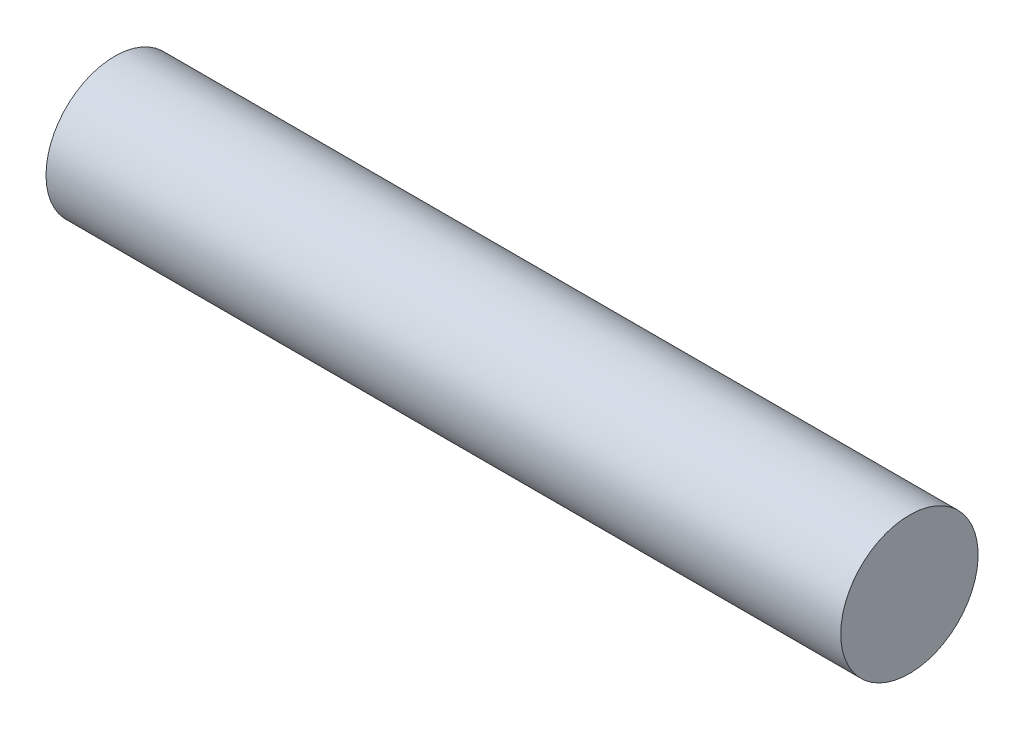
ISO-10303-21;
HEADER;
FILE_DESCRIPTION(('STEP AP214'),'2;1');
FILE_NAME('part.step','',(''),(''),'','','');
FILE_SCHEMA(('AUTOMOTIVE_DESIGN { 1 0 10303 214 1 1 1 1 }'));
ENDSEC;
DATA;
#1=APPLICATION_CONTEXT('core data for automotive mechanical design processes');
#2=APPLICATION_PROTOCOL_DEFINITION('international standard','automotive_design',2000,#1);
#3=PRODUCT_CONTEXT('',#1,'mechanical');
#4=PRODUCT('Part','Part','',(#3));
#5=PRODUCT_RELATED_PRODUCT_CATEGORY('part','',(#4));
#6=PRODUCT_DEFINITION_FORMATION('','',#4);
#7=PRODUCT_DEFINITION_CONTEXT('part definition',#1,'design');
#8=PRODUCT_DEFINITION('design','',#6,#7);
#9=PRODUCT_DEFINITION_SHAPE('','',#8);
#10=(LENGTH_UNIT() NAMED_UNIT(*) SI_UNIT(.MILLI.,.METRE.));
#11=(NAMED_UNIT(*) PLANE_ANGLE_UNIT() SI_UNIT($,.RADIAN.));
#12=(NAMED_UNIT(*) SI_UNIT($,.STERADIAN.) SOLID_ANGLE_UNIT());
#13=UNCERTAINTY_MEASURE_WITH_UNIT(LENGTH_MEASURE(1.E-05),#10,'distance_accuracy_value','');
#14=(GEOMETRIC_REPRESENTATION_CONTEXT(3) GLOBAL_UNCERTAINTY_ASSIGNED_CONTEXT((#13)) GLOBAL_UNIT_ASSIGNED_CONTEXT((#10,
#11,#12)) REPRESENTATION_CONTEXT('',''));
#15=CARTESIAN_POINT('',(0.,0.,0.));
#16=DIRECTION('',(0.,0.,1.));
#17=DIRECTION('',(1.,0.,0.));
#18=AXIS2_PLACEMENT_3D('',#15,#16,#17);
#19=CARTESIAN_POINT('',(0.,0.,0.));
#20=DIRECTION('',(1.,0.,0.));
#21=DIRECTION('',(0.,0.,-1.));
#22=AXIS2_PLACEMENT_3D('',#19,#20,#21);
#23=PLANE('',#22);
#24=CARTESIAN_POINT('',(0.,0.,0.));
#25=DIRECTION('',(-1.,0.,0.));
#26=DIRECTION('',(0.,0.,1.));
#27=AXIS2_PLACEMENT_3D('',#24,#25,#26);
#28=CIRCLE('',#27,7.);
#29=CARTESIAN_POINT('',(0.,0.,7.));
#30=VERTEX_POINT('',#29);
#31=EDGE_CURVE('E10',#30,#30,#28,.T.);
#32=ORIENTED_EDGE('',*,*,#31,.T.);
#33=EDGE_LOOP('',(#32));
#34=FACE_BOUND('',#33,.T.);
#35=ADVANCED_FACE('F43',(#34),#23,.F.);
#36=CARTESIAN_POINT('',(0.,0.,0.));
#37=DIRECTION('',(-1.,0.,0.));
#38=DIRECTION('',(0.,0.,1.));
#39=AXIS2_PLACEMENT_3D('',#36,#37,#38);
#40=CYLINDRICAL_SURFACE('',#39,7.);
#41=ORIENTED_EDGE('',*,*,#31,.F.);
#42=EDGE_LOOP('',(#41));
#43=FACE_BOUND('',#42,.T.);
#44=CARTESIAN_POINT('',(81.,0.,0.));
#45=DIRECTION('',(-1.,0.,0.));
#46=DIRECTION('',(0.,0.,1.));
#47=AXIS2_PLACEMENT_3D('',#44,#45,#46);
#48=CIRCLE('',#47,7.);
#49=CARTESIAN_POINT('',(81.,0.,7.));
#50=VERTEX_POINT('',#49);
#51=EDGE_CURVE('E50',#50,#50,#48,.T.);
#52=ORIENTED_EDGE('',*,*,#51,.T.);
#53=EDGE_LOOP('',(#52));
#54=FACE_BOUND('',#53,.T.);
#55=ADVANCED_FACE('F57',(#43,#54),#40,.T.);
#56=CARTESIAN_POINT('',(81.,7.,0.));
#57=DIRECTION('',(-1.,0.,0.));
#58=DIRECTION('',(0.,0.,1.));
#59=AXIS2_PLACEMENT_3D('',#56,#57,#58);
#60=PLANE('',#59);
#61=ORIENTED_EDGE('',*,*,#51,.F.);
#62=EDGE_LOOP('',(#61));
#63=FACE_BOUND('',#62,.T.);
#64=ADVANCED_FACE('F59',(#63),#60,.F.);
#65=CLOSED_SHELL('',(#35,#55,#64));
#66=MANIFOLD_SOLID_BREP('B2',#65);
#67=ADVANCED_BREP_SHAPE_REPRESENTATION('',(#18,#66),#14);
#68=SHAPE_DEFINITION_REPRESENTATION(#9,#67);
ENDSEC;
END-ISO-10303-21;
